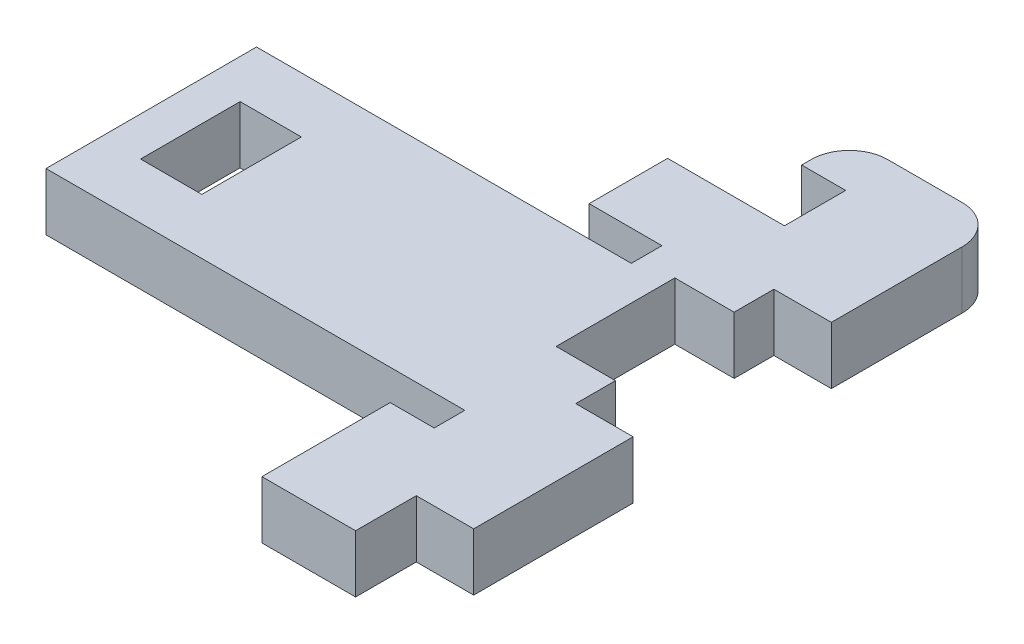
ISO-10303-21;
HEADER;
FILE_DESCRIPTION(('STEP AP214'),'2;1');
FILE_NAME('part.step','',(''),(''),'','','');
FILE_SCHEMA(('AUTOMOTIVE_DESIGN { 1 0 10303 214 1 1 1 1 }'));
ENDSEC;
DATA;
#1=APPLICATION_CONTEXT('core data for automotive mechanical design processes');
#2=APPLICATION_PROTOCOL_DEFINITION('international standard','automotive_design',2000,#1);
#3=PRODUCT_CONTEXT('',#1,'mechanical');
#4=PRODUCT('Part','Part','',(#3));
#5=PRODUCT_RELATED_PRODUCT_CATEGORY('part','',(#4));
#6=PRODUCT_DEFINITION_FORMATION('','',#4);
#7=PRODUCT_DEFINITION_CONTEXT('part definition',#1,'design');
#8=PRODUCT_DEFINITION('design','',#6,#7);
#9=PRODUCT_DEFINITION_SHAPE('','',#8);
#10=(LENGTH_UNIT() NAMED_UNIT(*) SI_UNIT(.MILLI.,.METRE.));
#11=(NAMED_UNIT(*) PLANE_ANGLE_UNIT() SI_UNIT($,.RADIAN.));
#12=(NAMED_UNIT(*) SI_UNIT($,.STERADIAN.) SOLID_ANGLE_UNIT());
#13=UNCERTAINTY_MEASURE_WITH_UNIT(LENGTH_MEASURE(1.E-05),#10,'distance_accuracy_value','');
#14=(GEOMETRIC_REPRESENTATION_CONTEXT(3) GLOBAL_UNCERTAINTY_ASSIGNED_CONTEXT((#13)) GLOBAL_UNIT_ASSIGNED_CONTEXT((#10,
#11,#12)) REPRESENTATION_CONTEXT('',''));
#15=CARTESIAN_POINT('',(0.,0.,0.));
#16=DIRECTION('',(0.,0.,1.));
#17=DIRECTION('',(1.,0.,0.));
#18=AXIS2_PLACEMENT_3D('',#15,#16,#17);
#19=CARTESIAN_POINT('',(83.894661100132,18.4,-13.5554998767088));
#20=DIRECTION('',(1.,0.,0.));
#21=DIRECTION('',(0.,0.,-1.));
#22=AXIS2_PLACEMENT_3D('',#19,#20,#21);
#23=PLANE('',#22);
#24=DIRECTION('',(0.,-1.,0.));
#25=VECTOR('',#24,1.);
#26=CARTESIAN_POINT('',(83.894661100132,72.14,-5.27797788773624));
#27=LINE('',#26,#25);
#28=CARTESIAN_POINT('',(83.894661100132,21.4,-5.27797788773624));
#29=VERTEX_POINT('',#28);
#30=CARTESIAN_POINT('',(83.894661100132,18.4,-5.27797788773624));
#31=VERTEX_POINT('',#30);
#32=EDGE_CURVE('E255',#29,#31,#27,.T.);
#33=ORIENTED_EDGE('',*,*,#32,.F.);
#34=DIRECTION('',(0.,0.,-1.));
#35=VECTOR('',#34,1.);
#36=CARTESIAN_POINT('',(83.894661100132,21.4,-13.5554998767088));
#37=LINE('',#36,#35);
#38=CARTESIAN_POINT('',(83.894661100132,21.4,-3.20045589876372));
#39=VERTEX_POINT('',#38);
#40=EDGE_CURVE('E390',#39,#29,#37,.T.);
#41=ORIENTED_EDGE('',*,*,#40,.F.);
#42=DIRECTION('',(0.,1.,0.));
#43=VECTOR('',#42,1.);
#44=CARTESIAN_POINT('',(83.894661100132,18.4,-3.20045589876372));
#45=LINE('',#44,#43);
#46=CARTESIAN_POINT('',(83.894661100132,18.4,-3.20045589876372));
#47=VERTEX_POINT('',#46);
#48=EDGE_CURVE('E442',#47,#39,#45,.T.);
#49=ORIENTED_EDGE('',*,*,#48,.F.);
#50=DIRECTION('',(0.,0.,-1.));
#51=VECTOR('',#50,1.);
#52=CARTESIAN_POINT('',(83.894661100132,18.4,-13.5554998767088));
#53=LINE('',#52,#51);
#54=EDGE_CURVE('E332',#47,#31,#53,.T.);
#55=ORIENTED_EDGE('',*,*,#54,.T.);
#56=EDGE_LOOP('',(#33,#41,#49,#55));
#57=FACE_BOUND('',#56,.T.);
#58=ADVANCED_FACE('F32',(#57),#23,.T.);
#59=CARTESIAN_POINT('',(81.3,18.4,0.));
#60=DIRECTION('',(-1.,0.,0.));
#61=DIRECTION('',(0.,0.,1.));
#62=AXIS2_PLACEMENT_3D('',#59,#60,#61);
#63=PLANE('',#62);
#64=DIRECTION('',(0.,0.,1.));
#65=VECTOR('',#64,1.);
#66=CARTESIAN_POINT('',(81.3,21.4,0.));
#67=LINE('',#66,#65);
#68=CARTESIAN_POINT('',(81.3,21.4,0.));
#69=VERTEX_POINT('',#68);
#70=CARTESIAN_POINT('',(81.3,21.4,1.6));
#71=VERTEX_POINT('',#70);
#72=EDGE_CURVE('E305',#69,#71,#67,.T.);
#73=ORIENTED_EDGE('',*,*,#72,.F.);
#74=DIRECTION('',(0.,1.,0.));
#75=VECTOR('',#74,1.);
#76=CARTESIAN_POINT('',(81.3,18.4,0.));
#77=LINE('',#76,#75);
#78=CARTESIAN_POINT('',(81.3,18.4,0.));
#79=VERTEX_POINT('',#78);
#80=EDGE_CURVE('E423',#79,#69,#77,.T.);
#81=ORIENTED_EDGE('',*,*,#80,.F.);
#82=DIRECTION('',(0.,0.,1.));
#83=VECTOR('',#82,1.);
#84=CARTESIAN_POINT('',(81.3,18.4,0.));
#85=LINE('',#84,#83);
#86=CARTESIAN_POINT('',(81.3,18.4,1.6));
#87=VERTEX_POINT('',#86);
#88=EDGE_CURVE('E306',#79,#87,#85,.T.);
#89=ORIENTED_EDGE('',*,*,#88,.T.);
#90=DIRECTION('',(0.,1.,0.));
#91=VECTOR('',#90,1.);
#92=CARTESIAN_POINT('',(81.3,18.4,1.6));
#93=LINE('',#92,#91);
#94=EDGE_CURVE('E365',#87,#71,#93,.T.);
#95=ORIENTED_EDGE('',*,*,#94,.T.);
#96=EDGE_LOOP('',(#73,#81,#89,#95));
#97=FACE_BOUND('',#96,.T.);
#98=ADVANCED_FACE('F566',(#97),#63,.T.);
#99=CARTESIAN_POINT('',(59.4182462524913,18.4,0.));
#100=DIRECTION('',(0.,0.,1.));
#101=DIRECTION('',(1.,0.,0.));
#102=AXIS2_PLACEMENT_3D('',#99,#100,#101);
#103=PLANE('',#102);
#104=DIRECTION('',(1.,0.,0.));
#105=VECTOR('',#104,1.);
#106=CARTESIAN_POINT('',(59.4182462524913,21.4,0.));
#107=LINE('',#106,#105);
#108=CARTESIAN_POINT('',(59.4182462524913,21.4,0.));
#109=VERTEX_POINT('',#108);
#110=EDGE_CURVE('E310',#109,#69,#107,.T.);
#111=ORIENTED_EDGE('',*,*,#110,.F.);
#112=DIRECTION('',(0.,1.,0.));
#113=VECTOR('',#112,1.);
#114=CARTESIAN_POINT('',(59.4182462524913,18.4,0.));
#115=LINE('',#114,#113);
#116=CARTESIAN_POINT('',(59.4182462524913,18.4,0.));
#117=VERTEX_POINT('',#116);
#118=EDGE_CURVE('E426',#117,#109,#115,.T.);
#119=ORIENTED_EDGE('',*,*,#118,.F.);
#120=DIRECTION('',(1.,0.,0.));
#121=VECTOR('',#120,1.);
#122=CARTESIAN_POINT('',(59.4182462524913,18.4,0.));
#123=LINE('',#122,#121);
#124=EDGE_CURVE('E362',#117,#79,#123,.T.);
#125=ORIENTED_EDGE('',*,*,#124,.T.);
#126=ORIENTED_EDGE('',*,*,#80,.T.);
#127=EDGE_LOOP('',(#111,#119,#125,#126));
#128=FACE_BOUND('',#127,.T.);
#129=ADVANCED_FACE('F561',(#128),#103,.T.);
#130=CARTESIAN_POINT('',(59.4182462524913,18.4,-11.));
#131=DIRECTION('',(-1.,0.,0.));
#132=DIRECTION('',(0.,0.,1.));
#133=AXIS2_PLACEMENT_3D('',#130,#131,#132);
#134=PLANE('',#133);
#135=DIRECTION('',(0.,0.,1.));
#136=VECTOR('',#135,1.);
#137=CARTESIAN_POINT('',(59.4182462524913,21.4,-11.));
#138=LINE('',#137,#136);
#139=CARTESIAN_POINT('',(59.4182462524913,21.4,-11.));
#140=VERTEX_POINT('',#139);
#141=EDGE_CURVE('E418',#140,#109,#138,.T.);
#142=ORIENTED_EDGE('',*,*,#141,.F.);
#143=DIRECTION('',(0.,1.,0.));
#144=VECTOR('',#143,1.);
#145=CARTESIAN_POINT('',(59.4182462524913,18.4,-11.));
#146=LINE('',#145,#144);
#147=CARTESIAN_POINT('',(59.4182462524913,18.4,-11.));
#148=VERTEX_POINT('',#147);
#149=EDGE_CURVE('E428',#148,#140,#146,.T.);
#150=ORIENTED_EDGE('',*,*,#149,.F.);
#151=DIRECTION('',(0.,0.,1.));
#152=VECTOR('',#151,1.);
#153=CARTESIAN_POINT('',(59.4182462524913,18.4,-11.));
#154=LINE('',#153,#152);
#155=EDGE_CURVE('E359',#148,#117,#154,.T.);
#156=ORIENTED_EDGE('',*,*,#155,.T.);
#157=ORIENTED_EDGE('',*,*,#118,.T.);
#158=EDGE_LOOP('',(#142,#150,#156,#157));
#159=FACE_BOUND('',#158,.T.);
#160=ADVANCED_FACE('F558',(#159),#134,.T.);
#161=CARTESIAN_POINT('',(79.,18.4,-11.));
#162=DIRECTION('',(0.,0.,-1.));
#163=DIRECTION('',(-1.,0.,0.));
#164=AXIS2_PLACEMENT_3D('',#161,#162,#163);
#165=PLANE('',#164);
#166=DIRECTION('',(-1.,0.,0.));
#167=VECTOR('',#166,1.);
#168=CARTESIAN_POINT('',(79.,21.4,-11.));
#169=LINE('',#168,#167);
#170=CARTESIAN_POINT('',(79.,21.4,-11.));
#171=VERTEX_POINT('',#170);
#172=EDGE_CURVE('E415',#171,#140,#169,.T.);
#173=ORIENTED_EDGE('',*,*,#172,.F.);
#174=DIRECTION('',(0.,1.,0.));
#175=VECTOR('',#174,1.);
#176=CARTESIAN_POINT('',(79.,18.4,-11.));
#177=LINE('',#176,#175);
#178=CARTESIAN_POINT('',(79.,18.4,-11.));
#179=VERTEX_POINT('',#178);
#180=EDGE_CURVE('E430',#179,#171,#177,.T.);
#181=ORIENTED_EDGE('',*,*,#180,.F.);
#182=DIRECTION('',(-1.,0.,0.));
#183=VECTOR('',#182,1.);
#184=CARTESIAN_POINT('',(79.,18.4,-11.));
#185=LINE('',#184,#183);
#186=EDGE_CURVE('E356',#179,#148,#185,.T.);
#187=ORIENTED_EDGE('',*,*,#186,.T.);
#188=ORIENTED_EDGE('',*,*,#149,.T.);
#189=EDGE_LOOP('',(#173,#181,#187,#188));
#190=FACE_BOUND('',#189,.T.);
#191=ADVANCED_FACE('F554',(#190),#165,.T.);
#192=CARTESIAN_POINT('',(79.,18.4,-12.6));
#193=DIRECTION('',(-1.,0.,0.));
#194=DIRECTION('',(0.,0.,1.));
#195=AXIS2_PLACEMENT_3D('',#192,#193,#194);
#196=PLANE('',#195);
#197=DIRECTION('',(0.,0.,1.));
#198=VECTOR('',#197,1.);
#199=CARTESIAN_POINT('',(79.,21.4,-12.6));
#200=LINE('',#199,#198);
#201=CARTESIAN_POINT('',(79.,21.4,-12.6));
#202=VERTEX_POINT('',#201);
#203=EDGE_CURVE('E412',#202,#171,#200,.T.);
#204=ORIENTED_EDGE('',*,*,#203,.F.);
#205=DIRECTION('',(0.,1.,0.));
#206=VECTOR('',#205,1.);
#207=CARTESIAN_POINT('',(79.,18.4,-12.6));
#208=LINE('',#207,#206);
#209=CARTESIAN_POINT('',(79.,18.4,-12.6));
#210=VERTEX_POINT('',#209);
#211=EDGE_CURVE('E432',#210,#202,#208,.T.);
#212=ORIENTED_EDGE('',*,*,#211,.F.);
#213=DIRECTION('',(0.,0.,1.));
#214=VECTOR('',#213,1.);
#215=CARTESIAN_POINT('',(79.,18.4,-12.6));
#216=LINE('',#215,#214);
#217=EDGE_CURVE('E353',#210,#179,#216,.T.);
#218=ORIENTED_EDGE('',*,*,#217,.T.);
#219=ORIENTED_EDGE('',*,*,#180,.T.);
#220=EDGE_LOOP('',(#204,#212,#218,#219));
#221=FACE_BOUND('',#220,.T.);
#222=ADVANCED_FACE('F552',(#221),#196,.T.);
#223=CARTESIAN_POINT('',(75.1952082309363,18.4,-12.6));
#224=DIRECTION('',(0.,0.,1.));
#225=DIRECTION('',(1.,0.,0.));
#226=AXIS2_PLACEMENT_3D('',#223,#224,#225);
#227=PLANE('',#226);
#228=DIRECTION('',(1.,0.,0.));
#229=VECTOR('',#228,1.);
#230=CARTESIAN_POINT('',(75.1952082309363,21.4,-12.6));
#231=LINE('',#230,#229);
#232=CARTESIAN_POINT('',(75.1952082309363,21.4,-12.6));
#233=VERTEX_POINT('',#232);
#234=EDGE_CURVE('E409',#233,#202,#231,.T.);
#235=ORIENTED_EDGE('',*,*,#234,.F.);
#236=DIRECTION('',(0.,1.,0.));
#237=VECTOR('',#236,1.);
#238=CARTESIAN_POINT('',(75.1952082309363,18.4,-12.6));
#239=LINE('',#238,#237);
#240=CARTESIAN_POINT('',(75.1952082309363,18.4,-12.6));
#241=VERTEX_POINT('',#240);
#242=EDGE_CURVE('E434',#241,#233,#239,.T.);
#243=ORIENTED_EDGE('',*,*,#242,.F.);
#244=DIRECTION('',(1.,0.,0.));
#245=VECTOR('',#244,1.);
#246=CARTESIAN_POINT('',(75.1952082309363,18.4,-12.6));
#247=LINE('',#246,#245);
#248=EDGE_CURVE('E350',#241,#210,#247,.T.);
#249=ORIENTED_EDGE('',*,*,#248,.T.);
#250=ORIENTED_EDGE('',*,*,#211,.T.);
#251=EDGE_LOOP('',(#235,#243,#249,#250));
#252=FACE_BOUND('',#251,.T.);
#253=ADVANCED_FACE('F548',(#252),#227,.T.);
#254=CARTESIAN_POINT('',(75.1952082309363,18.4,-16.8));
#255=DIRECTION('',(-1.,0.,0.));
#256=DIRECTION('',(0.,0.,1.));
#257=AXIS2_PLACEMENT_3D('',#254,#255,#256);
#258=PLANE('',#257);
#259=DIRECTION('',(0.,-1.,0.));
#260=VECTOR('',#259,1.);
#261=CARTESIAN_POINT('',(75.1952082309363,72.14,-16.7));
#262=LINE('',#261,#260);
#263=CARTESIAN_POINT('',(75.1952082309363,21.4,-16.7));
#264=VERTEX_POINT('',#263);
#265=CARTESIAN_POINT('',(75.1952082309363,18.4,-16.7));
#266=VERTEX_POINT('',#265);
#267=EDGE_CURVE('E295',#264,#266,#262,.T.);
#268=ORIENTED_EDGE('',*,*,#267,.T.);
#269=DIRECTION('',(0.,0.,1.));
#270=VECTOR('',#269,1.);
#271=CARTESIAN_POINT('',(75.1952082309363,18.4,-16.8));
#272=LINE('',#271,#270);
#273=EDGE_CURVE('E348',#266,#241,#272,.T.);
#274=ORIENTED_EDGE('',*,*,#273,.T.);
#275=ORIENTED_EDGE('',*,*,#242,.T.);
#276=DIRECTION('',(0.,0.,1.));
#277=VECTOR('',#276,1.);
#278=CARTESIAN_POINT('',(75.1952082309363,21.4,-16.8));
#279=LINE('',#278,#277);
#280=EDGE_CURVE('E407',#264,#233,#279,.T.);
#281=ORIENTED_EDGE('',*,*,#280,.F.);
#282=EDGE_LOOP('',(#268,#274,#275,#281));
#283=FACE_BOUND('',#282,.T.);
#284=ADVANCED_FACE('F541',(#283),#258,.T.);
#285=CARTESIAN_POINT('',(81.3,18.4,-19.8));
#286=DIRECTION('',(-1.,0.,0.));
#287=DIRECTION('',(0.,0.,1.));
#288=AXIS2_PLACEMENT_3D('',#285,#286,#287);
#289=PLANE('',#288);
#290=DIRECTION('',(0.,0.,1.));
#291=VECTOR('',#290,1.);
#292=CARTESIAN_POINT('',(81.3,21.4,-19.8));
#293=LINE('',#292,#291);
#294=CARTESIAN_POINT('',(81.3,21.4,-19.9));
#295=VERTEX_POINT('',#294);
#296=CARTESIAN_POINT('',(81.3,21.4,-16.7));
#297=VERTEX_POINT('',#296);
#298=EDGE_CURVE('E405',#295,#297,#293,.T.);
#299=ORIENTED_EDGE('',*,*,#298,.F.);
#300=DIRECTION('',(0.,-1.,0.));
#301=VECTOR('',#300,1.);
#302=CARTESIAN_POINT('',(81.3,72.14,-19.9));
#303=LINE('',#302,#301);
#304=CARTESIAN_POINT('',(81.3,18.4,-19.9));
#305=VERTEX_POINT('',#304);
#306=EDGE_CURVE('E294',#295,#305,#303,.T.);
#307=ORIENTED_EDGE('',*,*,#306,.T.);
#308=DIRECTION('',(0.,0.,1.));
#309=VECTOR('',#308,1.);
#310=CARTESIAN_POINT('',(81.3,18.4,-19.8));
#311=LINE('',#310,#309);
#312=CARTESIAN_POINT('',(81.3,18.4,-16.7));
#313=VERTEX_POINT('',#312);
#314=EDGE_CURVE('E346',#305,#313,#311,.T.);
#315=ORIENTED_EDGE('',*,*,#314,.T.);
#316=DIRECTION('',(0.,-1.,0.));
#317=VECTOR('',#316,1.);
#318=CARTESIAN_POINT('',(81.3,72.14,-16.7));
#319=LINE('',#318,#317);
#320=EDGE_CURVE('E299',#297,#313,#319,.T.);
#321=ORIENTED_EDGE('',*,*,#320,.F.);
#322=EDGE_LOOP('',(#299,#307,#315,#321));
#323=FACE_BOUND('',#322,.T.);
#324=ADVANCED_FACE('F535',(#323),#289,.T.);
#325=CARTESIAN_POINT('',(79.,18.4,-22.39560780373));
#326=DIRECTION('',(-1.,0.,0.));
#327=DIRECTION('',(0.,0.,1.));
#328=AXIS2_PLACEMENT_3D('',#325,#326,#327);
#329=PLANE('',#328);
#330=DIRECTION('',(0.,-1.,0.));
#331=VECTOR('',#330,1.);
#332=CARTESIAN_POINT('',(79.,18.4,-19.9));
#333=LINE('',#332,#331);
#334=CARTESIAN_POINT('',(79.,21.4,-19.9));
#335=VERTEX_POINT('',#334);
#336=CARTESIAN_POINT('',(79.,18.4,-19.9));
#337=VERTEX_POINT('',#336);
#338=EDGE_CURVE('E298',#335,#337,#333,.T.);
#339=ORIENTED_EDGE('',*,*,#338,.F.);
#340=DIRECTION('',(0.,0.,1.));
#341=VECTOR('',#340,1.);
#342=CARTESIAN_POINT('',(79.,21.4,-22.39560780373));
#343=LINE('',#342,#341);
#344=CARTESIAN_POINT('',(79.,21.4,-20.39560780373));
#345=VERTEX_POINT('',#344);
#346=EDGE_CURVE('E402',#345,#335,#343,.T.);
#347=ORIENTED_EDGE('',*,*,#346,.F.);
#348=DIRECTION('',(0.,1.,0.));
#349=VECTOR('',#348,1.);
#350=CARTESIAN_POINT('',(79.,18.4,-20.39560780373));
#351=LINE('',#350,#349);
#352=CARTESIAN_POINT('',(79.,18.4,-20.39560780373));
#353=VERTEX_POINT('',#352);
#354=EDGE_CURVE('E472',#345,#353,#351,.F.);
#355=ORIENTED_EDGE('',*,*,#354,.T.);
#356=DIRECTION('',(0.,0.,1.));
#357=VECTOR('',#356,1.);
#358=CARTESIAN_POINT('',(79.,18.4,-22.39560780373));
#359=LINE('',#358,#357);
#360=EDGE_CURVE('E343',#353,#337,#359,.T.);
#361=ORIENTED_EDGE('',*,*,#360,.T.);
#362=EDGE_LOOP('',(#339,#347,#355,#361));
#363=FACE_BOUND('',#362,.T.);
#364=ADVANCED_FACE('F527',(#363),#329,.T.);
#365=CARTESIAN_POINT('',(86.894661100132,18.4,-22.39560780373));
#366=DIRECTION('',(0.,0.,-1.));
#367=DIRECTION('',(-1.,0.,0.));
#368=AXIS2_PLACEMENT_3D('',#365,#366,#367);
#369=PLANE('',#368);
#370=DIRECTION('',(-1.,0.,0.));
#371=VECTOR('',#370,1.);
#372=CARTESIAN_POINT('',(86.894661100132,21.4,-22.39560780373));
#373=LINE('',#372,#371);
#374=CARTESIAN_POINT('',(84.894661100132,21.4,-22.39560780373));
#375=VERTEX_POINT('',#374);
#376=CARTESIAN_POINT('',(81.,21.4,-22.39560780373));
#377=VERTEX_POINT('',#376);
#378=EDGE_CURVE('E399',#375,#377,#373,.T.);
#379=ORIENTED_EDGE('',*,*,#378,.F.);
#380=DIRECTION('',(0.,1.,0.));
#381=VECTOR('',#380,1.);
#382=CARTESIAN_POINT('',(84.894661100132,18.4,-22.39560780373));
#383=LINE('',#382,#381);
#384=CARTESIAN_POINT('',(84.894661100132,18.4,-22.39560780373));
#385=VERTEX_POINT('',#384);
#386=EDGE_CURVE('E466',#375,#385,#383,.F.);
#387=ORIENTED_EDGE('',*,*,#386,.T.);
#388=DIRECTION('',(-1.,0.,0.));
#389=VECTOR('',#388,1.);
#390=CARTESIAN_POINT('',(86.894661100132,18.4,-22.39560780373));
#391=LINE('',#390,#389);
#392=CARTESIAN_POINT('',(81.,18.4,-22.39560780373));
#393=VERTEX_POINT('',#392);
#394=EDGE_CURVE('E340',#385,#393,#391,.T.);
#395=ORIENTED_EDGE('',*,*,#394,.T.);
#396=DIRECTION('',(0.,1.,0.));
#397=VECTOR('',#396,1.);
#398=CARTESIAN_POINT('',(81.,18.4,-22.39560780373));
#399=LINE('',#398,#397);
#400=EDGE_CURVE('E463',#393,#377,#399,.T.);
#401=ORIENTED_EDGE('',*,*,#400,.T.);
#402=EDGE_LOOP('',(#379,#387,#395,#401));
#403=FACE_BOUND('',#402,.T.);
#404=ADVANCED_FACE('F517',(#403),#369,.T.);
#405=CARTESIAN_POINT('',(86.894661100132,18.4,-13.5554998767088));
#406=DIRECTION('',(1.,0.,0.));
#407=DIRECTION('',(0.,0.,-1.));
#408=AXIS2_PLACEMENT_3D('',#405,#406,#407);
#409=PLANE('',#408);
#410=DIRECTION('',(0.,0.,-1.));
#411=VECTOR('',#410,1.);
#412=CARTESIAN_POINT('',(86.894661100132,18.4,-13.5554998767088));
#413=LINE('',#412,#411);
#414=CARTESIAN_POINT('',(86.894661100132,18.4,-13.5554998767088));
#415=VERTEX_POINT('',#414);
#416=CARTESIAN_POINT('',(86.894661100132,18.4,-20.39560780373));
#417=VERTEX_POINT('',#416);
#418=EDGE_CURVE('E337',#415,#417,#413,.T.);
#419=ORIENTED_EDGE('',*,*,#418,.T.);
#420=DIRECTION('',(0.,1.,0.));
#421=VECTOR('',#420,1.);
#422=CARTESIAN_POINT('',(86.894661100132,18.4,-20.39560780373));
#423=LINE('',#422,#421);
#424=CARTESIAN_POINT('',(86.894661100132,21.4,-20.39560780373));
#425=VERTEX_POINT('',#424);
#426=EDGE_CURVE('E425',#417,#425,#423,.T.);
#427=ORIENTED_EDGE('',*,*,#426,.T.);
#428=DIRECTION('',(0.,0.,-1.));
#429=VECTOR('',#428,1.);
#430=CARTESIAN_POINT('',(86.894661100132,21.4,-13.5554998767088));
#431=LINE('',#430,#429);
#432=CARTESIAN_POINT('',(86.894661100132,21.4,-13.5554998767088));
#433=VERTEX_POINT('',#432);
#434=EDGE_CURVE('E396',#433,#425,#431,.T.);
#435=ORIENTED_EDGE('',*,*,#434,.F.);
#436=DIRECTION('',(0.,1.,0.));
#437=VECTOR('',#436,1.);
#438=CARTESIAN_POINT('',(86.894661100132,18.4,-13.5554998767088));
#439=LINE('',#438,#437);
#440=EDGE_CURVE('E437',#415,#433,#439,.T.);
#441=ORIENTED_EDGE('',*,*,#440,.F.);
#442=EDGE_LOOP('',(#419,#427,#435,#441));
#443=FACE_BOUND('',#442,.T.);
#444=ADVANCED_FACE('F508',(#443),#409,.T.);
#445=CARTESIAN_POINT('',(83.894661100132,18.4,-13.5554998767088));
#446=DIRECTION('',(0.,0.,1.));
#447=DIRECTION('',(1.,0.,0.));
#448=AXIS2_PLACEMENT_3D('',#445,#446,#447);
#449=PLANE('',#448);
#450=DIRECTION('',(1.,0.,0.));
#451=VECTOR('',#450,1.);
#452=CARTESIAN_POINT('',(83.894661100132,21.4,-13.5554998767088));
#453=LINE('',#452,#451);
#454=CARTESIAN_POINT('',(83.894661100132,21.4,-13.5554998767088));
#455=VERTEX_POINT('',#454);
#456=EDGE_CURVE('E393',#455,#433,#453,.T.);
#457=ORIENTED_EDGE('',*,*,#456,.F.);
#458=DIRECTION('',(0.,1.,0.));
#459=VECTOR('',#458,1.);
#460=CARTESIAN_POINT('',(83.894661100132,18.4,-13.5554998767088));
#461=LINE('',#460,#459);
#462=CARTESIAN_POINT('',(83.894661100132,18.4,-13.5554998767088));
#463=VERTEX_POINT('',#462);
#464=EDGE_CURVE('E439',#463,#455,#461,.T.);
#465=ORIENTED_EDGE('',*,*,#464,.F.);
#466=DIRECTION('',(1.,0.,0.));
#467=VECTOR('',#466,1.);
#468=CARTESIAN_POINT('',(83.894661100132,18.4,-13.5554998767088));
#469=LINE('',#468,#467);
#470=EDGE_CURVE('E334',#463,#415,#469,.T.);
#471=ORIENTED_EDGE('',*,*,#470,.T.);
#472=ORIENTED_EDGE('',*,*,#440,.T.);
#473=EDGE_LOOP('',(#457,#465,#471,#472));
#474=FACE_BOUND('',#473,.T.);
#475=ADVANCED_FACE('F504',(#474),#449,.T.);
#476=DIRECTION('',(0.,-1.,0.));
#477=VECTOR('',#476,1.);
#478=CARTESIAN_POINT('',(83.894661100132,72.14,-11.4779778877362));
#479=LINE('',#478,#477);
#480=CARTESIAN_POINT('',(83.894661100132,21.4,-11.4779778877362));
#481=VERTEX_POINT('',#480);
#482=CARTESIAN_POINT('',(83.894661100132,18.4,-11.4779778877362));
#483=VERTEX_POINT('',#482);
#484=EDGE_CURVE('E267',#481,#483,#479,.T.);
#485=ORIENTED_EDGE('',*,*,#484,.T.);
#486=EDGE_CURVE('E331',#483,#463,#53,.T.);
#487=ORIENTED_EDGE('',*,*,#486,.T.);
#488=ORIENTED_EDGE('',*,*,#464,.T.);
#489=EDGE_CURVE('E389',#481,#455,#37,.T.);
#490=ORIENTED_EDGE('',*,*,#489,.F.);
#491=EDGE_LOOP('',(#485,#487,#488,#490));
#492=FACE_BOUND('',#491,.T.);
#493=ADVANCED_FACE('F499',(#492),#23,.T.);
#494=CARTESIAN_POINT('',(83.894661100132,18.4,-3.20045589876372));
#495=DIRECTION('',(0.,0.,-1.));
#496=DIRECTION('',(-1.,0.,0.));
#497=AXIS2_PLACEMENT_3D('',#494,#495,#496);
#498=PLANE('',#497);
#499=DIRECTION('',(-1.,0.,0.));
#500=VECTOR('',#499,1.);
#501=CARTESIAN_POINT('',(83.894661100132,21.4,-3.20045589876372));
#502=LINE('',#501,#500);
#503=CARTESIAN_POINT('',(86.894661100132,21.4,-3.20045589876372));
#504=VERTEX_POINT('',#503);
#505=EDGE_CURVE('E386',#504,#39,#502,.T.);
#506=ORIENTED_EDGE('',*,*,#505,.F.);
#507=DIRECTION('',(0.,1.,0.));
#508=VECTOR('',#507,1.);
#509=CARTESIAN_POINT('',(86.894661100132,18.4,-3.20045589876372));
#510=LINE('',#509,#508);
#511=CARTESIAN_POINT('',(86.894661100132,18.4,-3.20045589876372));
#512=VERTEX_POINT('',#511);
#513=EDGE_CURVE('E444',#512,#504,#510,.T.);
#514=ORIENTED_EDGE('',*,*,#513,.F.);
#515=DIRECTION('',(-1.,0.,0.));
#516=VECTOR('',#515,1.);
#517=CARTESIAN_POINT('',(83.894661100132,18.4,-3.20045589876372));
#518=LINE('',#517,#516);
#519=EDGE_CURVE('E328',#512,#47,#518,.T.);
#520=ORIENTED_EDGE('',*,*,#519,.T.);
#521=ORIENTED_EDGE('',*,*,#48,.T.);
#522=EDGE_LOOP('',(#506,#514,#520,#521));
#523=FACE_BOUND('',#522,.T.);
#524=ADVANCED_FACE('F594',(#523),#498,.T.);
#525=CARTESIAN_POINT('',(86.894661100132,18.4,-3.20045589876372));
#526=DIRECTION('',(1.,0.,0.));
#527=DIRECTION('',(0.,0.,-1.));
#528=AXIS2_PLACEMENT_3D('',#525,#526,#527);
#529=PLANE('',#528);
#530=DIRECTION('',(0.,0.,-1.));
#531=VECTOR('',#530,1.);
#532=CARTESIAN_POINT('',(86.894661100132,21.4,-3.20045589876372));
#533=LINE('',#532,#531);
#534=CARTESIAN_POINT('',(86.894661100132,21.4,5.12999479698806));
#535=VERTEX_POINT('',#534);
#536=EDGE_CURVE('E383',#535,#504,#533,.T.);
#537=ORIENTED_EDGE('',*,*,#536,.F.);
#538=DIRECTION('',(0.,1.,0.));
#539=VECTOR('',#538,1.);
#540=CARTESIAN_POINT('',(86.894661100132,18.4,5.12999479698806));
#541=LINE('',#540,#539);
#542=CARTESIAN_POINT('',(86.894661100132,18.4,5.12999479698806));
#543=VERTEX_POINT('',#542);
#544=EDGE_CURVE('E446',#543,#535,#541,.T.);
#545=ORIENTED_EDGE('',*,*,#544,.F.);
#546=DIRECTION('',(0.,0.,-1.));
#547=VECTOR('',#546,1.);
#548=CARTESIAN_POINT('',(86.894661100132,18.4,-3.20045589876372));
#549=LINE('',#548,#547);
#550=EDGE_CURVE('E325',#543,#512,#549,.T.);
#551=ORIENTED_EDGE('',*,*,#550,.T.);
#552=ORIENTED_EDGE('',*,*,#513,.T.);
#553=EDGE_LOOP('',(#537,#545,#551,#552));
#554=FACE_BOUND('',#553,.T.);
#555=ADVANCED_FACE('F590',(#554),#529,.T.);
#556=CARTESIAN_POINT('',(86.894661100132,18.4,5.12999479698806));
#557=DIRECTION('',(0.,0.,1.));
#558=DIRECTION('',(1.,0.,0.));
#559=AXIS2_PLACEMENT_3D('',#556,#557,#558);
#560=PLANE('',#559);
#561=DIRECTION('',(1.,0.,0.));
#562=VECTOR('',#561,1.);
#563=CARTESIAN_POINT('',(86.894661100132,21.4,5.12999479698806));
#564=LINE('',#563,#562);
#565=CARTESIAN_POINT('',(83.894661100132,21.4,5.12999479698806));
#566=VERTEX_POINT('',#565);
#567=EDGE_CURVE('E380',#566,#535,#564,.T.);
#568=ORIENTED_EDGE('',*,*,#567,.F.);
#569=DIRECTION('',(0.,1.,0.));
#570=VECTOR('',#569,1.);
#571=CARTESIAN_POINT('',(83.894661100132,18.4,5.12999479698806));
#572=LINE('',#571,#570);
#573=CARTESIAN_POINT('',(83.894661100132,18.4,5.12999479698806));
#574=VERTEX_POINT('',#573);
#575=EDGE_CURVE('E448',#574,#566,#572,.T.);
#576=ORIENTED_EDGE('',*,*,#575,.F.);
#577=DIRECTION('',(1.,0.,0.));
#578=VECTOR('',#577,1.);
#579=CARTESIAN_POINT('',(86.894661100132,18.4,5.12999479698806));
#580=LINE('',#579,#578);
#581=EDGE_CURVE('E322',#574,#543,#580,.T.);
#582=ORIENTED_EDGE('',*,*,#581,.T.);
#583=ORIENTED_EDGE('',*,*,#544,.T.);
#584=EDGE_LOOP('',(#568,#576,#582,#583));
#585=FACE_BOUND('',#584,.T.);
#586=ADVANCED_FACE('F586',(#585),#560,.T.);
#587=CARTESIAN_POINT('',(83.894661100132,18.4,5.12999479698806));
#588=DIRECTION('',(1.,0.,0.));
#589=DIRECTION('',(0.,0.,-1.));
#590=AXIS2_PLACEMENT_3D('',#587,#588,#589);
#591=PLANE('',#590);
#592=DIRECTION('',(0.,0.,-1.));
#593=VECTOR('',#592,1.);
#594=CARTESIAN_POINT('',(83.894661100132,21.4,5.12999479698806));
#595=LINE('',#594,#593);
#596=CARTESIAN_POINT('',(83.894661100132,21.4,8.30134827662476));
#597=VERTEX_POINT('',#596);
#598=EDGE_CURVE('E377',#597,#566,#595,.T.);
#599=ORIENTED_EDGE('',*,*,#598,.F.);
#600=DIRECTION('',(0.,1.,0.));
#601=VECTOR('',#600,1.);
#602=CARTESIAN_POINT('',(83.894661100132,18.4,8.30134827662476));
#603=LINE('',#602,#601);
#604=CARTESIAN_POINT('',(83.894661100132,18.4,8.30134827662476));
#605=VERTEX_POINT('',#604);
#606=EDGE_CURVE('E450',#605,#597,#603,.T.);
#607=ORIENTED_EDGE('',*,*,#606,.F.);
#608=DIRECTION('',(0.,0.,-1.));
#609=VECTOR('',#608,1.);
#610=CARTESIAN_POINT('',(83.894661100132,18.4,5.12999479698806));
#611=LINE('',#610,#609);
#612=EDGE_CURVE('E319',#605,#574,#611,.T.);
#613=ORIENTED_EDGE('',*,*,#612,.T.);
#614=ORIENTED_EDGE('',*,*,#575,.T.);
#615=EDGE_LOOP('',(#599,#607,#613,#614));
#616=FACE_BOUND('',#615,.T.);
#617=ADVANCED_FACE('F582',(#616),#591,.T.);
#618=CARTESIAN_POINT('',(79.,18.4,8.30134827662476));
#619=DIRECTION('',(0.,0.,1.));
#620=DIRECTION('',(1.,0.,0.));
#621=AXIS2_PLACEMENT_3D('',#618,#619,#620);
#622=PLANE('',#621);
#623=DIRECTION('',(1.,0.,0.));
#624=VECTOR('',#623,1.);
#625=CARTESIAN_POINT('',(79.,21.4,8.30134827662476));
#626=LINE('',#625,#624);
#627=CARTESIAN_POINT('',(79.,21.4,8.30134827662476));
#628=VERTEX_POINT('',#627);
#629=EDGE_CURVE('E374',#628,#597,#626,.T.);
#630=ORIENTED_EDGE('',*,*,#629,.F.);
#631=DIRECTION('',(0.,1.,0.));
#632=VECTOR('',#631,1.);
#633=CARTESIAN_POINT('',(79.,18.4,8.30134827662476));
#634=LINE('',#633,#632);
#635=CARTESIAN_POINT('',(79.,18.4,8.30134827662476));
#636=VERTEX_POINT('',#635);
#637=EDGE_CURVE('E452',#636,#628,#634,.T.);
#638=ORIENTED_EDGE('',*,*,#637,.F.);
#639=DIRECTION('',(1.,0.,0.));
#640=VECTOR('',#639,1.);
#641=CARTESIAN_POINT('',(79.,18.4,8.30134827662476));
#642=LINE('',#641,#640);
#643=EDGE_CURVE('E316',#636,#605,#642,.T.);
#644=ORIENTED_EDGE('',*,*,#643,.T.);
#645=ORIENTED_EDGE('',*,*,#606,.T.);
#646=EDGE_LOOP('',(#630,#638,#644,#645));
#647=FACE_BOUND('',#646,.T.);
#648=ADVANCED_FACE('F578',(#647),#622,.T.);
#649=CARTESIAN_POINT('',(79.,18.4,1.6));
#650=DIRECTION('',(-1.,0.,0.));
#651=DIRECTION('',(0.,0.,1.));
#652=AXIS2_PLACEMENT_3D('',#649,#650,#651);
#653=PLANE('',#652);
#654=DIRECTION('',(0.,0.,1.));
#655=VECTOR('',#654,1.);
#656=CARTESIAN_POINT('',(79.,21.4,1.6));
#657=LINE('',#656,#655);
#658=CARTESIAN_POINT('',(79.,21.4,1.6));
#659=VERTEX_POINT('',#658);
#660=EDGE_CURVE('E371',#659,#628,#657,.T.);
#661=ORIENTED_EDGE('',*,*,#660,.F.);
#662=DIRECTION('',(0.,1.,0.));
#663=VECTOR('',#662,1.);
#664=CARTESIAN_POINT('',(79.,18.4,1.6));
#665=LINE('',#664,#663);
#666=CARTESIAN_POINT('',(79.,18.4,1.6));
#667=VERTEX_POINT('',#666);
#668=EDGE_CURVE('E454',#667,#659,#665,.T.);
#669=ORIENTED_EDGE('',*,*,#668,.F.);
#670=DIRECTION('',(0.,0.,1.));
#671=VECTOR('',#670,1.);
#672=CARTESIAN_POINT('',(79.,18.4,1.6));
#673=LINE('',#672,#671);
#674=EDGE_CURVE('E313',#667,#636,#673,.T.);
#675=ORIENTED_EDGE('',*,*,#674,.T.);
#676=ORIENTED_EDGE('',*,*,#637,.T.);
#677=EDGE_LOOP('',(#661,#669,#675,#676));
#678=FACE_BOUND('',#677,.T.);
#679=ADVANCED_FACE('F574',(#678),#653,.T.);
#680=CARTESIAN_POINT('',(81.3,18.4,1.6));
#681=DIRECTION('',(0.,0.,-1.));
#682=DIRECTION('',(-1.,0.,0.));
#683=AXIS2_PLACEMENT_3D('',#680,#681,#682);
#684=PLANE('',#683);
#685=DIRECTION('',(-1.,0.,0.));
#686=VECTOR('',#685,1.);
#687=CARTESIAN_POINT('',(81.3,21.4,1.6));
#688=LINE('',#687,#686);
#689=EDGE_CURVE('E368',#71,#659,#688,.T.);
#690=ORIENTED_EDGE('',*,*,#689,.F.);
#691=ORIENTED_EDGE('',*,*,#94,.F.);
#692=DIRECTION('',(-1.,0.,0.));
#693=VECTOR('',#692,1.);
#694=CARTESIAN_POINT('',(81.3,18.4,1.6));
#695=LINE('',#694,#693);
#696=EDGE_CURVE('E309',#87,#667,#695,.T.);
#697=ORIENTED_EDGE('',*,*,#696,.T.);
#698=ORIENTED_EDGE('',*,*,#668,.T.);
#699=EDGE_LOOP('',(#690,#691,#697,#698));
#700=FACE_BOUND('',#699,.T.);
#701=ADVANCED_FACE('F570',(#700),#684,.T.);
#702=CARTESIAN_POINT('',(0.,18.4,0.));
#703=DIRECTION('',(0.,-1.,0.));
#704=DIRECTION('',(0.,0.,-1.));
#705=AXIS2_PLACEMENT_3D('',#702,#703,#704);
#706=PLANE('',#705);
#707=DIRECTION('',(-1.,0.,0.));
#708=VECTOR('',#707,1.);
#709=CARTESIAN_POINT('',(83.894661100132,18.4,-5.27797788773624));
#710=LINE('',#709,#708);
#711=CARTESIAN_POINT('',(80.794661100132,18.4,-5.27797788773624));
#712=VERTEX_POINT('',#711);
#713=EDGE_CURVE('E252',#31,#712,#710,.T.);
#714=ORIENTED_EDGE('',*,*,#713,.F.);
#715=ORIENTED_EDGE('',*,*,#54,.F.);
#716=ORIENTED_EDGE('',*,*,#519,.F.);
#717=ORIENTED_EDGE('',*,*,#550,.F.);
#718=ORIENTED_EDGE('',*,*,#581,.F.);
#719=ORIENTED_EDGE('',*,*,#612,.F.);
#720=ORIENTED_EDGE('',*,*,#643,.F.);
#721=ORIENTED_EDGE('',*,*,#674,.F.);
#722=ORIENTED_EDGE('',*,*,#696,.F.);
#723=ORIENTED_EDGE('',*,*,#88,.F.);
#724=ORIENTED_EDGE('',*,*,#124,.F.);
#725=ORIENTED_EDGE('',*,*,#155,.F.);
#726=ORIENTED_EDGE('',*,*,#186,.F.);
#727=ORIENTED_EDGE('',*,*,#217,.F.);
#728=ORIENTED_EDGE('',*,*,#248,.F.);
#729=ORIENTED_EDGE('',*,*,#273,.F.);
#730=DIRECTION('',(-1.,0.,0.));
#731=VECTOR('',#730,1.);
#732=CARTESIAN_POINT('',(81.3,18.4,-16.7));
#733=LINE('',#732,#731);
#734=EDGE_CURVE('E292',#313,#266,#733,.T.);
#735=ORIENTED_EDGE('',*,*,#734,.F.);
#736=ORIENTED_EDGE('',*,*,#314,.F.);
#737=DIRECTION('',(1.,0.,0.));
#738=VECTOR('',#737,1.);
#739=CARTESIAN_POINT('',(79.,18.4,-19.9));
#740=LINE('',#739,#738);
#741=EDGE_CURVE('E284',#337,#305,#740,.T.);
#742=ORIENTED_EDGE('',*,*,#741,.F.);
#743=ORIENTED_EDGE('',*,*,#360,.F.);
#744=CARTESIAN_POINT('',(81.,18.4,-20.39560780373));
#745=DIRECTION('',(0.,-1.,0.));
#746=DIRECTION('',(0.,0.,-1.));
#747=AXIS2_PLACEMENT_3D('',#744,#745,#746);
#748=CIRCLE('',#747,2.);
#749=EDGE_CURVE('E468',#353,#393,#748,.T.);
#750=ORIENTED_EDGE('',*,*,#749,.T.);
#751=ORIENTED_EDGE('',*,*,#394,.F.);
#752=CARTESIAN_POINT('',(84.894661100132,18.4,-20.39560780373));
#753=DIRECTION('',(0.,-1.,0.));
#754=DIRECTION('',(0.,0.,-1.));
#755=AXIS2_PLACEMENT_3D('',#752,#753,#754);
#756=CIRCLE('',#755,2.);
#757=EDGE_CURVE('E470',#385,#417,#756,.T.);
#758=ORIENTED_EDGE('',*,*,#757,.T.);
#759=ORIENTED_EDGE('',*,*,#418,.F.);
#760=ORIENTED_EDGE('',*,*,#470,.F.);
#761=ORIENTED_EDGE('',*,*,#486,.F.);
#762=DIRECTION('',(1.,0.,0.));
#763=VECTOR('',#762,1.);
#764=CARTESIAN_POINT('',(80.794661100132,18.4,-11.4779778877362));
#765=LINE('',#764,#763);
#766=CARTESIAN_POINT('',(80.794661100132,18.4,-11.4779778877362));
#767=VERTEX_POINT('',#766);
#768=EDGE_CURVE('E249',#767,#483,#765,.T.);
#769=ORIENTED_EDGE('',*,*,#768,.F.);
#770=DIRECTION('',(0.,0.,-1.));
#771=VECTOR('',#770,1.);
#772=CARTESIAN_POINT('',(80.794661100132,18.4,-5.27797788773624));
#773=LINE('',#772,#771);
#774=EDGE_CURVE('E244',#712,#767,#773,.T.);
#775=ORIENTED_EDGE('',*,*,#774,.F.);
#776=EDGE_LOOP('',(#714,#715,#716,#717,#718,#719,#720,#721,#722,#723,#724,#725,#726,#727,#728,
#729,#735,#736,#742,#743,#750,#751,#758,#759,#760,#761,#769,#775));
#777=FACE_BOUND('',#776,.T.);
#778=DIRECTION('',(-1.,0.,0.));
#779=VECTOR('',#778,1.);
#780=CARTESIAN_POINT('',(64.66,18.4,-2.9));
#781=LINE('',#780,#779);
#782=CARTESIAN_POINT('',(64.66,18.4,-2.9));
#783=VERTEX_POINT('',#782);
#784=CARTESIAN_POINT('',(61.46,18.4,-2.9));
#785=VERTEX_POINT('',#784);
#786=EDGE_CURVE('E55',#783,#785,#781,.T.);
#787=ORIENTED_EDGE('',*,*,#786,.F.);
#788=DIRECTION('',(0.,0.,1.));
#789=VECTOR('',#788,1.);
#790=CARTESIAN_POINT('',(64.66,18.4,-8.1));
#791=LINE('',#790,#789);
#792=CARTESIAN_POINT('',(64.66,18.4,-8.1));
#793=VERTEX_POINT('',#792);
#794=EDGE_CURVE('E278',#793,#783,#791,.T.);
#795=ORIENTED_EDGE('',*,*,#794,.F.);
#796=DIRECTION('',(1.,0.,0.));
#797=VECTOR('',#796,1.);
#798=CARTESIAN_POINT('',(61.46,18.4,-8.1));
#799=LINE('',#798,#797);
#800=CARTESIAN_POINT('',(61.46,18.4,-8.1));
#801=VERTEX_POINT('',#800);
#802=EDGE_CURVE('E275',#801,#793,#799,.T.);
#803=ORIENTED_EDGE('',*,*,#802,.F.);
#804=DIRECTION('',(0.,0.,-1.));
#805=VECTOR('',#804,1.);
#806=CARTESIAN_POINT('',(61.46,18.4,-2.9));
#807=LINE('',#806,#805);
#808=EDGE_CURVE('E272',#785,#801,#807,.T.);
#809=ORIENTED_EDGE('',*,*,#808,.F.);
#810=EDGE_LOOP('',(#787,#795,#803,#809));
#811=FACE_BOUND('',#810,.T.);
#812=ADVANCED_FACE('F260',(#777,#811),#706,.T.);
#813=CARTESIAN_POINT('',(0.,21.4,0.));
#814=DIRECTION('',(0.,-1.,0.));
#815=DIRECTION('',(0.,0.,-1.));
#816=AXIS2_PLACEMENT_3D('',#813,#814,#815);
#817=PLANE('',#816);
#818=ORIENTED_EDGE('',*,*,#40,.T.);
#819=DIRECTION('',(-1.,0.,0.));
#820=VECTOR('',#819,1.);
#821=CARTESIAN_POINT('',(0.,21.4,-5.27797788773624));
#822=LINE('',#821,#820);
#823=CARTESIAN_POINT('',(80.794661100132,21.4,-5.27797788773624));
#824=VERTEX_POINT('',#823);
#825=EDGE_CURVE('E11',#29,#824,#822,.T.);
#826=ORIENTED_EDGE('',*,*,#825,.T.);
#827=DIRECTION('',(0.,0.,-1.));
#828=VECTOR('',#827,1.);
#829=CARTESIAN_POINT('',(80.794661100132,21.4,0.));
#830=LINE('',#829,#828);
#831=CARTESIAN_POINT('',(80.794661100132,21.4,-11.4779778877362));
#832=VERTEX_POINT('',#831);
#833=EDGE_CURVE('E247',#824,#832,#830,.T.);
#834=ORIENTED_EDGE('',*,*,#833,.T.);
#835=DIRECTION('',(1.,0.,0.));
#836=VECTOR('',#835,1.);
#837=CARTESIAN_POINT('',(0.,21.4,-11.4779778877362));
#838=LINE('',#837,#836);
#839=EDGE_CURVE('E40',#832,#481,#838,.T.);
#840=ORIENTED_EDGE('',*,*,#839,.T.);
#841=ORIENTED_EDGE('',*,*,#489,.T.);
#842=ORIENTED_EDGE('',*,*,#456,.T.);
#843=ORIENTED_EDGE('',*,*,#434,.T.);
#844=CARTESIAN_POINT('',(84.894661100132,21.4,-20.39560780373));
#845=DIRECTION('',(0.,-1.,0.));
#846=DIRECTION('',(0.,0.,-1.));
#847=AXIS2_PLACEMENT_3D('',#844,#845,#846);
#848=CIRCLE('',#847,2.);
#849=EDGE_CURVE('E461',#425,#375,#848,.F.);
#850=ORIENTED_EDGE('',*,*,#849,.T.);
#851=ORIENTED_EDGE('',*,*,#378,.T.);
#852=CARTESIAN_POINT('',(81.,21.4,-20.39560780373));
#853=DIRECTION('',(0.,-1.,0.));
#854=DIRECTION('',(0.,0.,-1.));
#855=AXIS2_PLACEMENT_3D('',#852,#853,#854);
#856=CIRCLE('',#855,2.);
#857=EDGE_CURVE('E459',#377,#345,#856,.F.);
#858=ORIENTED_EDGE('',*,*,#857,.T.);
#859=ORIENTED_EDGE('',*,*,#346,.T.);
#860=DIRECTION('',(1.,0.,0.));
#861=VECTOR('',#860,1.);
#862=CARTESIAN_POINT('',(0.,21.4,-19.9));
#863=LINE('',#862,#861);
#864=EDGE_CURVE('E474',#335,#295,#863,.T.);
#865=ORIENTED_EDGE('',*,*,#864,.T.);
#866=ORIENTED_EDGE('',*,*,#298,.T.);
#867=DIRECTION('',(-1.,0.,0.));
#868=VECTOR('',#867,1.);
#869=CARTESIAN_POINT('',(0.,21.4,-16.7));
#870=LINE('',#869,#868);
#871=EDGE_CURVE('E477',#297,#264,#870,.T.);
#872=ORIENTED_EDGE('',*,*,#871,.T.);
#873=ORIENTED_EDGE('',*,*,#280,.T.);
#874=ORIENTED_EDGE('',*,*,#234,.T.);
#875=ORIENTED_EDGE('',*,*,#203,.T.);
#876=ORIENTED_EDGE('',*,*,#172,.T.);
#877=ORIENTED_EDGE('',*,*,#141,.T.);
#878=ORIENTED_EDGE('',*,*,#110,.T.);
#879=ORIENTED_EDGE('',*,*,#72,.T.);
#880=ORIENTED_EDGE('',*,*,#689,.T.);
#881=ORIENTED_EDGE('',*,*,#660,.T.);
#882=ORIENTED_EDGE('',*,*,#629,.T.);
#883=ORIENTED_EDGE('',*,*,#598,.T.);
#884=ORIENTED_EDGE('',*,*,#567,.T.);
#885=ORIENTED_EDGE('',*,*,#536,.T.);
#886=ORIENTED_EDGE('',*,*,#505,.T.);
#887=EDGE_LOOP('',(#818,#826,#834,#840,#841,#842,#843,#850,#851,#858,#859,#865,#866,#872,#873,
#874,#875,#876,#877,#878,#879,#880,#881,#882,#883,#884,#885,#886));
#888=FACE_BOUND('',#887,.T.);
#889=DIRECTION('',(0.,0.,1.));
#890=VECTOR('',#889,1.);
#891=CARTESIAN_POINT('',(64.66,21.4,0.));
#892=LINE('',#891,#890);
#893=CARTESIAN_POINT('',(64.66,21.4,-8.1));
#894=VERTEX_POINT('',#893);
#895=CARTESIAN_POINT('',(64.66,21.4,-2.9));
#896=VERTEX_POINT('',#895);
#897=EDGE_CURVE('E486',#894,#896,#892,.T.);
#898=ORIENTED_EDGE('',*,*,#897,.T.);
#899=DIRECTION('',(-1.,0.,0.));
#900=VECTOR('',#899,1.);
#901=CARTESIAN_POINT('',(0.,21.4,-2.9));
#902=LINE('',#901,#900);
#903=CARTESIAN_POINT('',(61.46,21.4,-2.9));
#904=VERTEX_POINT('',#903);
#905=EDGE_CURVE('E489',#896,#904,#902,.T.);
#906=ORIENTED_EDGE('',*,*,#905,.T.);
#907=DIRECTION('',(0.,0.,-1.));
#908=VECTOR('',#907,1.);
#909=CARTESIAN_POINT('',(61.46,21.4,0.));
#910=LINE('',#909,#908);
#911=CARTESIAN_POINT('',(61.46,21.4,-8.1));
#912=VERTEX_POINT('',#911);
#913=EDGE_CURVE('E480',#904,#912,#910,.T.);
#914=ORIENTED_EDGE('',*,*,#913,.T.);
#915=DIRECTION('',(1.,0.,0.));
#916=VECTOR('',#915,1.);
#917=CARTESIAN_POINT('',(0.,21.4,-8.1));
#918=LINE('',#917,#916);
#919=EDGE_CURVE('E483',#912,#894,#918,.T.);
#920=ORIENTED_EDGE('',*,*,#919,.T.);
#921=EDGE_LOOP('',(#898,#906,#914,#920));
#922=FACE_BOUND('',#921,.T.);
#923=ADVANCED_FACE('F495',(#888,#922),#817,.F.);
#924=CARTESIAN_POINT('',(84.894661100132,18.4,-20.39560780373));
#925=DIRECTION('',(0.,1.,0.));
#926=DIRECTION('',(0.,0.,1.));
#927=AXIS2_PLACEMENT_3D('',#924,#925,#926);
#928=CYLINDRICAL_SURFACE('',#927,2.);
#929=ORIENTED_EDGE('',*,*,#757,.F.);
#930=ORIENTED_EDGE('',*,*,#386,.F.);
#931=ORIENTED_EDGE('',*,*,#849,.F.);
#932=ORIENTED_EDGE('',*,*,#426,.F.);
#933=EDGE_LOOP('',(#929,#930,#931,#932));
#934=FACE_BOUND('',#933,.T.);
#935=ADVANCED_FACE('F513',(#934),#928,.T.);
#936=CARTESIAN_POINT('',(81.,18.4,-20.39560780373));
#937=DIRECTION('',(0.,1.,0.));
#938=DIRECTION('',(0.,0.,1.));
#939=AXIS2_PLACEMENT_3D('',#936,#937,#938);
#940=CYLINDRICAL_SURFACE('',#939,2.);
#941=ORIENTED_EDGE('',*,*,#749,.F.);
#942=ORIENTED_EDGE('',*,*,#354,.F.);
#943=ORIENTED_EDGE('',*,*,#857,.F.);
#944=ORIENTED_EDGE('',*,*,#400,.F.);
#945=EDGE_LOOP('',(#941,#942,#943,#944));
#946=FACE_BOUND('',#945,.T.);
#947=ADVANCED_FACE('F34',(#946),#940,.T.);
#948=CARTESIAN_POINT('',(79.,72.14,-19.9));
#949=DIRECTION('',(0.,0.,-1.));
#950=DIRECTION('',(-1.,0.,0.));
#951=AXIS2_PLACEMENT_3D('',#948,#949,#950);
#952=PLANE('',#951);
#953=ORIENTED_EDGE('',*,*,#338,.T.);
#954=ORIENTED_EDGE('',*,*,#741,.T.);
#955=ORIENTED_EDGE('',*,*,#306,.F.);
#956=ORIENTED_EDGE('',*,*,#864,.F.);
#957=EDGE_LOOP('',(#953,#954,#955,#956));
#958=FACE_BOUND('',#957,.T.);
#959=ADVANCED_FACE('F529',(#958),#952,.F.);
#960=CARTESIAN_POINT('',(81.3,72.14,-16.7));
#961=DIRECTION('',(0.,0.,1.));
#962=DIRECTION('',(1.,0.,0.));
#963=AXIS2_PLACEMENT_3D('',#960,#961,#962);
#964=PLANE('',#963);
#965=ORIENTED_EDGE('',*,*,#320,.T.);
#966=ORIENTED_EDGE('',*,*,#734,.T.);
#967=ORIENTED_EDGE('',*,*,#267,.F.);
#968=ORIENTED_EDGE('',*,*,#871,.F.);
#969=EDGE_LOOP('',(#965,#966,#967,#968));
#970=FACE_BOUND('',#969,.T.);
#971=ADVANCED_FACE('F539',(#970),#964,.F.);
#972=CARTESIAN_POINT('',(64.66,72.14,-2.9));
#973=DIRECTION('',(0.,0.,1.));
#974=DIRECTION('',(1.,0.,0.));
#975=AXIS2_PLACEMENT_3D('',#972,#973,#974);
#976=PLANE('',#975);
#977=DIRECTION('',(0.,-1.,0.));
#978=VECTOR('',#977,1.);
#979=CARTESIAN_POINT('',(64.66,72.14,-2.9));
#980=LINE('',#979,#978);
#981=EDGE_CURVE('E282',#896,#783,#980,.T.);
#982=ORIENTED_EDGE('',*,*,#981,.T.);
#983=ORIENTED_EDGE('',*,*,#786,.T.);
#984=DIRECTION('',(0.,-1.,0.));
#985=VECTOR('',#984,1.);
#986=CARTESIAN_POINT('',(61.46,72.14,-2.9));
#987=LINE('',#986,#985);
#988=EDGE_CURVE('E281',#904,#785,#987,.T.);
#989=ORIENTED_EDGE('',*,*,#988,.F.);
#990=ORIENTED_EDGE('',*,*,#905,.F.);
#991=EDGE_LOOP('',(#982,#983,#989,#990));
#992=FACE_BOUND('',#991,.T.);
#993=ADVANCED_FACE('F641',(#992),#976,.F.);
#994=CARTESIAN_POINT('',(64.66,72.14,-8.1));
#995=DIRECTION('',(1.,0.,0.));
#996=DIRECTION('',(0.,0.,-1.));
#997=AXIS2_PLACEMENT_3D('',#994,#995,#996);
#998=PLANE('',#997);
#999=DIRECTION('',(0.,-1.,0.));
#1000=VECTOR('',#999,1.);
#1001=CARTESIAN_POINT('',(64.66,72.14,-8.1));
#1002=LINE('',#1001,#1000);
#1003=EDGE_CURVE('E285',#894,#793,#1002,.T.);
#1004=ORIENTED_EDGE('',*,*,#1003,.T.);
#1005=ORIENTED_EDGE('',*,*,#794,.T.);
#1006=ORIENTED_EDGE('',*,*,#981,.F.);
#1007=ORIENTED_EDGE('',*,*,#897,.F.);
#1008=EDGE_LOOP('',(#1004,#1005,#1006,#1007));
#1009=FACE_BOUND('',#1008,.T.);
#1010=ADVANCED_FACE('F644',(#1009),#998,.F.);
#1011=CARTESIAN_POINT('',(61.46,72.14,-8.1));
#1012=DIRECTION('',(0.,0.,-1.));
#1013=DIRECTION('',(-1.,0.,0.));
#1014=AXIS2_PLACEMENT_3D('',#1011,#1012,#1013);
#1015=PLANE('',#1014);
#1016=DIRECTION('',(0.,-1.,0.));
#1017=VECTOR('',#1016,1.);
#1018=CARTESIAN_POINT('',(61.46,72.14,-8.1));
#1019=LINE('',#1018,#1017);
#1020=EDGE_CURVE('E287',#912,#801,#1019,.T.);
#1021=ORIENTED_EDGE('',*,*,#1020,.T.);
#1022=ORIENTED_EDGE('',*,*,#802,.T.);
#1023=ORIENTED_EDGE('',*,*,#1003,.F.);
#1024=ORIENTED_EDGE('',*,*,#919,.F.);
#1025=EDGE_LOOP('',(#1021,#1022,#1023,#1024));
#1026=FACE_BOUND('',#1025,.T.);
#1027=ADVANCED_FACE('F648',(#1026),#1015,.F.);
#1028=CARTESIAN_POINT('',(61.46,72.14,-2.9));
#1029=DIRECTION('',(-1.,0.,0.));
#1030=DIRECTION('',(0.,0.,1.));
#1031=AXIS2_PLACEMENT_3D('',#1028,#1029,#1030);
#1032=PLANE('',#1031);
#1033=ORIENTED_EDGE('',*,*,#988,.T.);
#1034=ORIENTED_EDGE('',*,*,#808,.T.);
#1035=ORIENTED_EDGE('',*,*,#1020,.F.);
#1036=ORIENTED_EDGE('',*,*,#913,.F.);
#1037=EDGE_LOOP('',(#1033,#1034,#1035,#1036));
#1038=FACE_BOUND('',#1037,.T.);
#1039=ADVANCED_FACE('F645',(#1038),#1032,.F.);
#1040=CARTESIAN_POINT('',(83.894661100132,72.14,-5.27797788773624));
#1041=DIRECTION('',(0.,0.,1.));
#1042=DIRECTION('',(1.,0.,0.));
#1043=AXIS2_PLACEMENT_3D('',#1040,#1041,#1042);
#1044=PLANE('',#1043);
#1045=ORIENTED_EDGE('',*,*,#32,.T.);
#1046=ORIENTED_EDGE('',*,*,#713,.T.);
#1047=DIRECTION('',(0.,-1.,0.));
#1048=VECTOR('',#1047,1.);
#1049=CARTESIAN_POINT('',(80.794661100132,72.14,-5.27797788773624));
#1050=LINE('',#1049,#1048);
#1051=EDGE_CURVE('E240',#824,#712,#1050,.T.);
#1052=ORIENTED_EDGE('',*,*,#1051,.F.);
#1053=ORIENTED_EDGE('',*,*,#825,.F.);
#1054=EDGE_LOOP('',(#1045,#1046,#1052,#1053));
#1055=FACE_BOUND('',#1054,.T.);
#1056=ADVANCED_FACE('F253',(#1055),#1044,.F.);
#1057=CARTESIAN_POINT('',(80.794661100132,72.14,-11.4779778877362));
#1058=DIRECTION('',(0.,0.,-1.));
#1059=DIRECTION('',(-1.,0.,0.));
#1060=AXIS2_PLACEMENT_3D('',#1057,#1058,#1059);
#1061=PLANE('',#1060);
#1062=DIRECTION('',(0.,-1.,0.));
#1063=VECTOR('',#1062,1.);
#1064=CARTESIAN_POINT('',(80.794661100132,72.14,-11.4779778877362));
#1065=LINE('',#1064,#1063);
#1066=EDGE_CURVE('E47',#832,#767,#1065,.T.);
#1067=ORIENTED_EDGE('',*,*,#1066,.T.);
#1068=ORIENTED_EDGE('',*,*,#768,.T.);
#1069=ORIENTED_EDGE('',*,*,#484,.F.);
#1070=ORIENTED_EDGE('',*,*,#839,.F.);
#1071=EDGE_LOOP('',(#1067,#1068,#1069,#1070));
#1072=FACE_BOUND('',#1071,.T.);
#1073=ADVANCED_FACE('F658',(#1072),#1061,.F.);
#1074=CARTESIAN_POINT('',(80.794661100132,72.14,-5.27797788773624));
#1075=DIRECTION('',(-1.,0.,0.));
#1076=DIRECTION('',(0.,0.,1.));
#1077=AXIS2_PLACEMENT_3D('',#1074,#1075,#1076);
#1078=PLANE('',#1077);
#1079=ORIENTED_EDGE('',*,*,#1051,.T.);
#1080=ORIENTED_EDGE('',*,*,#774,.T.);
#1081=ORIENTED_EDGE('',*,*,#1066,.F.);
#1082=ORIENTED_EDGE('',*,*,#833,.F.);
#1083=EDGE_LOOP('',(#1079,#1080,#1081,#1082));
#1084=FACE_BOUND('',#1083,.T.);
#1085=ADVANCED_FACE('F242',(#1084),#1078,.F.);
#1086=CLOSED_SHELL('',(#58,#98,#129,#160,#191,#222,#253,#284,#324,#364,#404,#444,#475,#493,#524,
#555,#586,#617,#648,#679,#701,#812,#923,#935,#947,#959,#971,#993,#1010,#1027,#1039,#1056,#1073,#1085));
#1087=MANIFOLD_SOLID_BREP('B2',#1086);
#1088=ADVANCED_BREP_SHAPE_REPRESENTATION('',(#18,#1087),#14);
#1089=SHAPE_DEFINITION_REPRESENTATION(#9,#1088);
ENDSEC;
END-ISO-10303-21;
